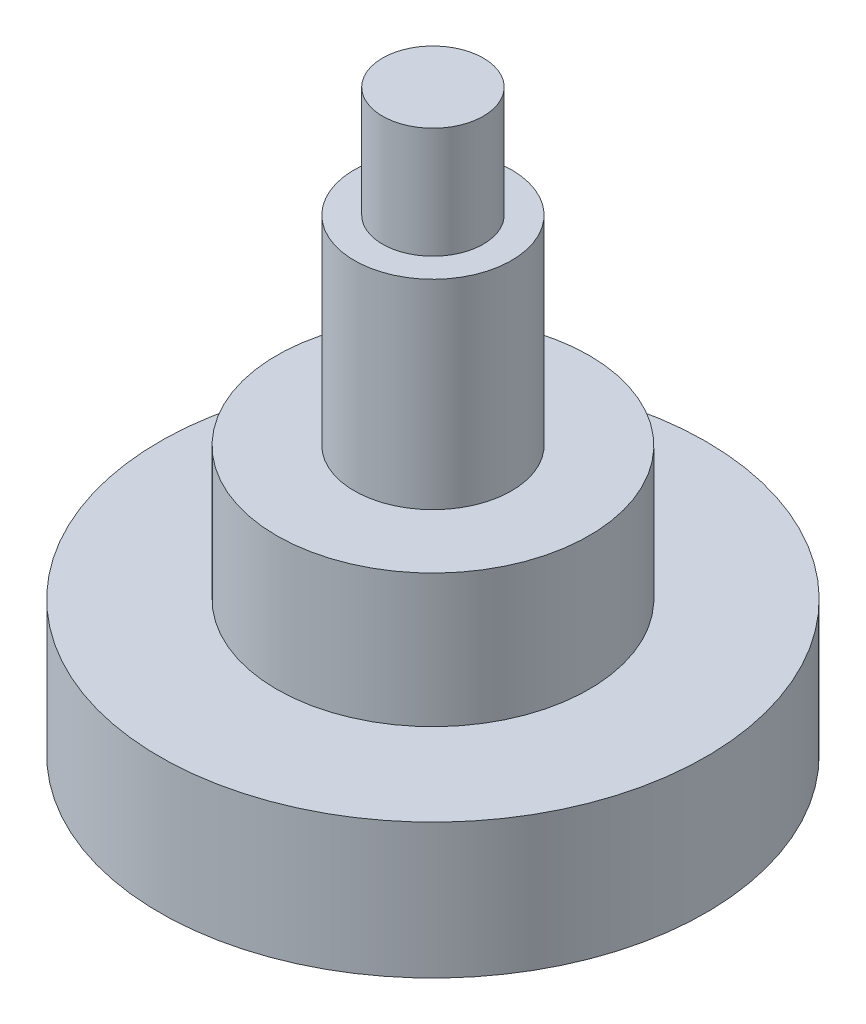
ISO-10303-21;
HEADER;
FILE_DESCRIPTION(('STEP AP214'),'2;1');
FILE_NAME('part.step','',(''),(''),'','','');
FILE_SCHEMA(('AUTOMOTIVE_DESIGN { 1 0 10303 214 1 1 1 1 }'));
ENDSEC;
DATA;
#1=APPLICATION_CONTEXT('core data for automotive mechanical design processes');
#2=APPLICATION_PROTOCOL_DEFINITION('international standard','automotive_design',2000,#1);
#3=PRODUCT_CONTEXT('',#1,'mechanical');
#4=PRODUCT('Part','Part','',(#3));
#5=PRODUCT_RELATED_PRODUCT_CATEGORY('part','',(#4));
#6=PRODUCT_DEFINITION_FORMATION('','',#4);
#7=PRODUCT_DEFINITION_CONTEXT('part definition',#1,'design');
#8=PRODUCT_DEFINITION('design','',#6,#7);
#9=PRODUCT_DEFINITION_SHAPE('','',#8);
#10=(LENGTH_UNIT() NAMED_UNIT(*) SI_UNIT(.MILLI.,.METRE.));
#11=(NAMED_UNIT(*) PLANE_ANGLE_UNIT() SI_UNIT($,.RADIAN.));
#12=(NAMED_UNIT(*) SI_UNIT($,.STERADIAN.) SOLID_ANGLE_UNIT());
#13=UNCERTAINTY_MEASURE_WITH_UNIT(LENGTH_MEASURE(1.E-05),#10,'distance_accuracy_value','');
#14=(GEOMETRIC_REPRESENTATION_CONTEXT(3) GLOBAL_UNCERTAINTY_ASSIGNED_CONTEXT((#13)) GLOBAL_UNIT_ASSIGNED_CONTEXT((#10,
#11,#12)) REPRESENTATION_CONTEXT('',''));
#15=CARTESIAN_POINT('',(0.,0.,0.));
#16=DIRECTION('',(0.,0.,1.));
#17=DIRECTION('',(1.,0.,0.));
#18=AXIS2_PLACEMENT_3D('',#15,#16,#17);
#19=CARTESIAN_POINT('',(1.25000000000002,0.,0.));
#20=DIRECTION('',(0.,-1.,0.));
#21=DIRECTION('',(0.,0.,-1.));
#22=AXIS2_PLACEMENT_3D('',#19,#20,#21);
#23=PLANE('',#22);
#24=CARTESIAN_POINT('',(0.,0.,0.));
#25=DIRECTION('',(0.,-1.,0.));
#26=DIRECTION('',(0.,0.,-1.));
#27=AXIS2_PLACEMENT_3D('',#24,#25,#26);
#28=CIRCLE('',#27,1.25000000000002);
#29=CARTESIAN_POINT('',(0.,0.,-1.25000000000002));
#30=VERTEX_POINT('',#29);
#31=EDGE_CURVE('E66',#30,#30,#28,.T.);
#32=ORIENTED_EDGE('',*,*,#31,.T.);
#33=EDGE_LOOP('',(#32));
#34=FACE_BOUND('',#33,.T.);
#35=ADVANCED_FACE('F32',(#34),#23,.T.);
#36=CARTESIAN_POINT('',(0.,17.1,0.));
#37=DIRECTION('',(0.,1.,0.));
#38=DIRECTION('',(0.,0.,1.));
#39=AXIS2_PLACEMENT_3D('',#36,#37,#38);
#40=PLANE('',#39);
#41=CARTESIAN_POINT('',(0.,17.1,0.));
#42=DIRECTION('',(0.,-1.,0.));
#43=DIRECTION('',(0.,0.,-1.));
#44=AXIS2_PLACEMENT_3D('',#41,#42,#43);
#45=CIRCLE('',#44,1.25);
#46=CARTESIAN_POINT('',(0.,17.1,-1.25));
#47=VERTEX_POINT('',#46);
#48=EDGE_CURVE('E10',#47,#47,#45,.T.);
#49=ORIENTED_EDGE('',*,*,#48,.F.);
#50=EDGE_LOOP('',(#49));
#51=FACE_BOUND('',#50,.T.);
#52=ADVANCED_FACE('F83',(#51),#40,.T.);
#53=CARTESIAN_POINT('',(0.,0.,0.));
#54=DIRECTION('',(0.,-1.,0.));
#55=DIRECTION('',(0.,0.,-1.));
#56=AXIS2_PLACEMENT_3D('',#53,#54,#55);
#57=CYLINDRICAL_SURFACE('',#56,1.25);
#58=ORIENTED_EDGE('',*,*,#48,.T.);
#59=EDGE_LOOP('',(#58));
#60=FACE_BOUND('',#59,.T.);
#61=CARTESIAN_POINT('',(0.,14.35,0.));
#62=DIRECTION('',(0.,-1.,0.));
#63=DIRECTION('',(0.,0.,-1.));
#64=AXIS2_PLACEMENT_3D('',#61,#62,#63);
#65=CIRCLE('',#64,1.25);
#66=CARTESIAN_POINT('',(0.,14.35,-1.25));
#67=VERTEX_POINT('',#66);
#68=EDGE_CURVE('E38',#67,#67,#65,.T.);
#69=ORIENTED_EDGE('',*,*,#68,.F.);
#70=EDGE_LOOP('',(#69));
#71=FACE_BOUND('',#70,.T.);
#72=ADVANCED_FACE('F87',(#60,#71),#57,.T.);
#73=CARTESIAN_POINT('',(1.25,14.35,0.));
#74=DIRECTION('',(0.,1.,0.));
#75=DIRECTION('',(0.,0.,1.));
#76=AXIS2_PLACEMENT_3D('',#73,#74,#75);
#77=PLANE('',#76);
#78=ORIENTED_EDGE('',*,*,#68,.T.);
#79=EDGE_LOOP('',(#78));
#80=FACE_BOUND('',#79,.T.);
#81=CARTESIAN_POINT('',(0.,14.35,0.));
#82=DIRECTION('',(0.,-1.,0.));
#83=DIRECTION('',(0.,0.,-1.));
#84=AXIS2_PLACEMENT_3D('',#81,#82,#83);
#85=CIRCLE('',#84,1.95);
#86=CARTESIAN_POINT('',(0.,14.35,-1.95));
#87=VERTEX_POINT('',#86);
#88=EDGE_CURVE('E42',#87,#87,#85,.T.);
#89=ORIENTED_EDGE('',*,*,#88,.F.);
#90=EDGE_LOOP('',(#89));
#91=FACE_BOUND('',#90,.T.);
#92=ADVANCED_FACE('F92',(#80,#91),#77,.T.);
#93=CARTESIAN_POINT('',(0.,0.,0.));
#94=DIRECTION('',(0.,-1.,0.));
#95=DIRECTION('',(0.,0.,-1.));
#96=AXIS2_PLACEMENT_3D('',#93,#94,#95);
#97=CYLINDRICAL_SURFACE('',#96,1.95);
#98=ORIENTED_EDGE('',*,*,#88,.T.);
#99=EDGE_LOOP('',(#98));
#100=FACE_BOUND('',#99,.T.);
#101=CARTESIAN_POINT('',(0.,9.4,0.));
#102=DIRECTION('',(0.,-1.,0.));
#103=DIRECTION('',(0.,0.,-1.));
#104=AXIS2_PLACEMENT_3D('',#101,#102,#103);
#105=CIRCLE('',#104,1.95000000000001);
#106=CARTESIAN_POINT('',(0.,9.4,-1.95000000000001));
#107=VERTEX_POINT('',#106);
#108=EDGE_CURVE('E46',#107,#107,#105,.T.);
#109=ORIENTED_EDGE('',*,*,#108,.F.);
#110=EDGE_LOOP('',(#109));
#111=FACE_BOUND('',#110,.T.);
#112=ADVANCED_FACE('F97',(#100,#111),#97,.T.);
#113=CARTESIAN_POINT('',(1.95000000000001,9.4,0.));
#114=DIRECTION('',(0.,1.,0.));
#115=DIRECTION('',(0.,0.,1.));
#116=AXIS2_PLACEMENT_3D('',#113,#114,#115);
#117=PLANE('',#116);
#118=ORIENTED_EDGE('',*,*,#108,.T.);
#119=EDGE_LOOP('',(#118));
#120=FACE_BOUND('',#119,.T.);
#121=CARTESIAN_POINT('',(0.,9.4,0.));
#122=DIRECTION('',(0.,-1.,0.));
#123=DIRECTION('',(0.,0.,-1.));
#124=AXIS2_PLACEMENT_3D('',#121,#122,#123);
#125=CIRCLE('',#124,3.875);
#126=CARTESIAN_POINT('',(0.,9.4,-3.875));
#127=VERTEX_POINT('',#126);
#128=EDGE_CURVE('E51',#127,#127,#125,.T.);
#129=ORIENTED_EDGE('',*,*,#128,.F.);
#130=EDGE_LOOP('',(#129));
#131=FACE_BOUND('',#130,.T.);
#132=ADVANCED_FACE('F100',(#120,#131),#117,.T.);
#133=CARTESIAN_POINT('',(0.,0.,0.));
#134=DIRECTION('',(0.,-1.,0.));
#135=DIRECTION('',(0.,0.,-1.));
#136=AXIS2_PLACEMENT_3D('',#133,#134,#135);
#137=CYLINDRICAL_SURFACE('',#136,3.875);
#138=ORIENTED_EDGE('',*,*,#128,.T.);
#139=EDGE_LOOP('',(#138));
#140=FACE_BOUND('',#139,.T.);
#141=CARTESIAN_POINT('',(0.,6.1,0.));
#142=DIRECTION('',(0.,-1.,0.));
#143=DIRECTION('',(0.,0.,-1.));
#144=AXIS2_PLACEMENT_3D('',#141,#142,#143);
#145=CIRCLE('',#144,3.875);
#146=CARTESIAN_POINT('',(0.,6.1,-3.875));
#147=VERTEX_POINT('',#146);
#148=EDGE_CURVE('E54',#147,#147,#145,.T.);
#149=ORIENTED_EDGE('',*,*,#148,.F.);
#150=EDGE_LOOP('',(#149));
#151=FACE_BOUND('',#150,.T.);
#152=ADVANCED_FACE('F104',(#140,#151),#137,.T.);
#153=CARTESIAN_POINT('',(3.875,6.1,0.));
#154=DIRECTION('',(0.,1.,0.));
#155=DIRECTION('',(0.,0.,1.));
#156=AXIS2_PLACEMENT_3D('',#153,#154,#155);
#157=PLANE('',#156);
#158=ORIENTED_EDGE('',*,*,#148,.T.);
#159=EDGE_LOOP('',(#158));
#160=FACE_BOUND('',#159,.T.);
#161=CARTESIAN_POINT('',(0.,6.1,0.));
#162=DIRECTION('',(0.,-1.,0.));
#163=DIRECTION('',(0.,0.,-1.));
#164=AXIS2_PLACEMENT_3D('',#161,#162,#163);
#165=CIRCLE('',#164,6.775);
#166=CARTESIAN_POINT('',(0.,6.1,-6.775));
#167=VERTEX_POINT('',#166);
#168=EDGE_CURVE('E57',#167,#167,#165,.T.);
#169=ORIENTED_EDGE('',*,*,#168,.F.);
#170=EDGE_LOOP('',(#169));
#171=FACE_BOUND('',#170,.T.);
#172=ADVANCED_FACE('F108',(#160,#171),#157,.T.);
#173=CARTESIAN_POINT('',(0.,0.,0.));
#174=DIRECTION('',(0.,-1.,0.));
#175=DIRECTION('',(0.,0.,-1.));
#176=AXIS2_PLACEMENT_3D('',#173,#174,#175);
#177=CYLINDRICAL_SURFACE('',#176,6.775);
#178=ORIENTED_EDGE('',*,*,#168,.T.);
#179=EDGE_LOOP('',(#178));
#180=FACE_BOUND('',#179,.T.);
#181=CARTESIAN_POINT('',(0.,2.75,0.));
#182=DIRECTION('',(0.,-1.,0.));
#183=DIRECTION('',(0.,0.,-1.));
#184=AXIS2_PLACEMENT_3D('',#181,#182,#183);
#185=CIRCLE('',#184,6.775);
#186=CARTESIAN_POINT('',(0.,2.75,-6.775));
#187=VERTEX_POINT('',#186);
#188=EDGE_CURVE('E60',#187,#187,#185,.T.);
#189=ORIENTED_EDGE('',*,*,#188,.F.);
#190=EDGE_LOOP('',(#189));
#191=FACE_BOUND('',#190,.T.);
#192=ADVANCED_FACE('F79',(#180,#191),#177,.T.);
#193=CARTESIAN_POINT('',(6.775,2.75,0.));
#194=DIRECTION('',(0.,-1.,0.));
#195=DIRECTION('',(0.,0.,-1.));
#196=AXIS2_PLACEMENT_3D('',#193,#194,#195);
#197=PLANE('',#196);
#198=ORIENTED_EDGE('',*,*,#188,.T.);
#199=EDGE_LOOP('',(#198));
#200=FACE_BOUND('',#199,.T.);
#201=CARTESIAN_POINT('',(0.,2.75,0.));
#202=DIRECTION('',(0.,-1.,0.));
#203=DIRECTION('',(0.,0.,-1.));
#204=AXIS2_PLACEMENT_3D('',#201,#202,#203);
#205=CIRCLE('',#204,1.25000000000002);
#206=CARTESIAN_POINT('',(0.,2.75,-1.25000000000002));
#207=VERTEX_POINT('',#206);
#208=EDGE_CURVE('E63',#207,#207,#205,.T.);
#209=ORIENTED_EDGE('',*,*,#208,.F.);
#210=EDGE_LOOP('',(#209));
#211=FACE_BOUND('',#210,.T.);
#212=ADVANCED_FACE('F73',(#200,#211),#197,.T.);
#213=CARTESIAN_POINT('',(0.,0.,0.));
#214=DIRECTION('',(0.,-1.,0.));
#215=DIRECTION('',(0.,0.,-1.));
#216=AXIS2_PLACEMENT_3D('',#213,#214,#215);
#217=CYLINDRICAL_SURFACE('',#216,1.25000000000002);
#218=ORIENTED_EDGE('',*,*,#208,.T.);
#219=EDGE_LOOP('',(#218));
#220=FACE_BOUND('',#219,.T.);
#221=ORIENTED_EDGE('',*,*,#31,.F.);
#222=EDGE_LOOP('',(#221));
#223=FACE_BOUND('',#222,.T.);
#224=ADVANCED_FACE('F71',(#220,#223),#217,.T.);
#225=CLOSED_SHELL('',(#35,#52,#72,#92,#112,#132,#152,#172,#192,#212,#224));
#226=MANIFOLD_SOLID_BREP('B2',#225);
#227=ADVANCED_BREP_SHAPE_REPRESENTATION('',(#18,#226),#14);
#228=SHAPE_DEFINITION_REPRESENTATION(#9,#227);
ENDSEC;
END-ISO-10303-21;
